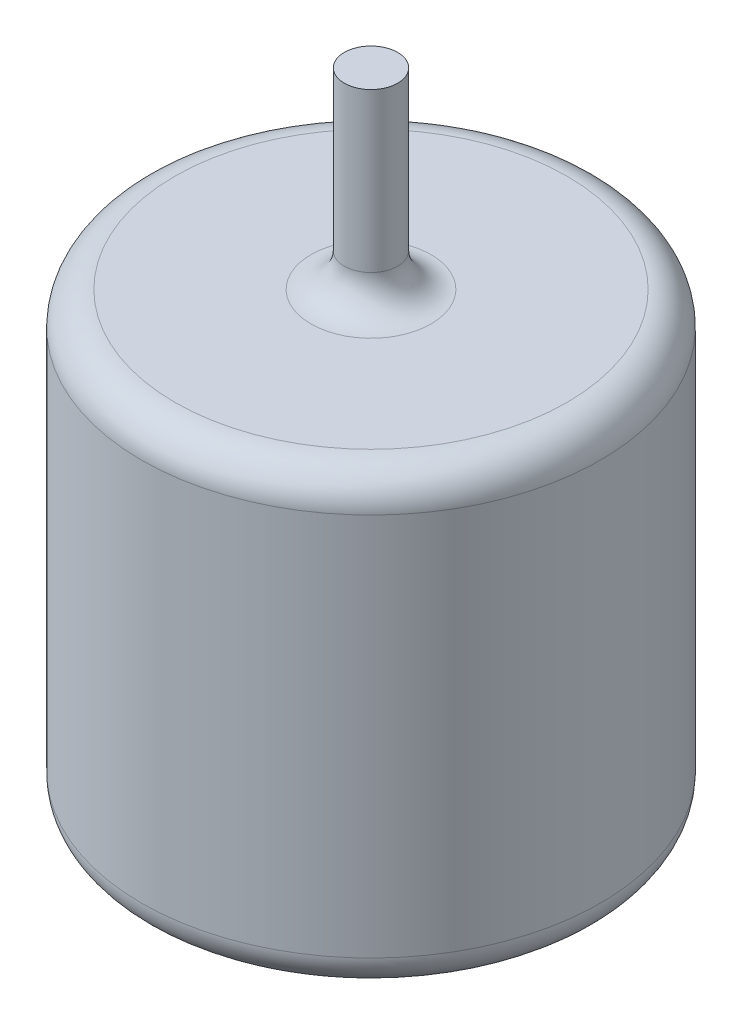
ISO-10303-21;
HEADER;
FILE_DESCRIPTION(('STEP AP214'),'2;1');
FILE_NAME('part.step','',(''),(''),'','','');
FILE_SCHEMA(('AUTOMOTIVE_DESIGN { 1 0 10303 214 1 1 1 1 }'));
ENDSEC;
DATA;
#1=APPLICATION_CONTEXT('core data for automotive mechanical design processes');
#2=APPLICATION_PROTOCOL_DEFINITION('international standard','automotive_design',2000,#1);
#3=PRODUCT_CONTEXT('',#1,'mechanical');
#4=PRODUCT('Part','Part','',(#3));
#5=PRODUCT_RELATED_PRODUCT_CATEGORY('part','',(#4));
#6=PRODUCT_DEFINITION_FORMATION('','',#4);
#7=PRODUCT_DEFINITION_CONTEXT('part definition',#1,'design');
#8=PRODUCT_DEFINITION('design','',#6,#7);
#9=PRODUCT_DEFINITION_SHAPE('','',#8);
#10=(LENGTH_UNIT() NAMED_UNIT(*) SI_UNIT(.MILLI.,.METRE.));
#11=(NAMED_UNIT(*) PLANE_ANGLE_UNIT() SI_UNIT($,.RADIAN.));
#12=(NAMED_UNIT(*) SI_UNIT($,.STERADIAN.) SOLID_ANGLE_UNIT());
#13=UNCERTAINTY_MEASURE_WITH_UNIT(LENGTH_MEASURE(1.E-05),#10,'distance_accuracy_value','');
#14=(GEOMETRIC_REPRESENTATION_CONTEXT(3) GLOBAL_UNCERTAINTY_ASSIGNED_CONTEXT((#13)) GLOBAL_UNIT_ASSIGNED_CONTEXT((#10,
#11,#12)) REPRESENTATION_CONTEXT('',''));
#15=CARTESIAN_POINT('',(0.,0.,0.));
#16=DIRECTION('',(0.,0.,1.));
#17=DIRECTION('',(1.,0.,0.));
#18=AXIS2_PLACEMENT_3D('',#15,#16,#17);
#19=CARTESIAN_POINT('',(0.,27.,0.));
#20=DIRECTION('',(0.,-1.,0.));
#21=DIRECTION('',(0.,0.,-1.));
#22=AXIS2_PLACEMENT_3D('',#19,#20,#21);
#23=CYLINDRICAL_SURFACE('',#22,13.75);
#24=CARTESIAN_POINT('',(0.,2.,0.));
#25=DIRECTION('',(0.,1.,0.));
#26=DIRECTION('',(0.,0.,1.));
#27=AXIS2_PLACEMENT_3D('',#24,#25,#26);
#28=CIRCLE('',#27,13.75);
#29=CARTESIAN_POINT('',(0.,2.,13.75));
#30=VERTEX_POINT('',#29);
#31=EDGE_CURVE('E53',#30,#30,#28,.T.);
#32=ORIENTED_EDGE('',*,*,#31,.T.);
#33=EDGE_LOOP('',(#32));
#34=FACE_BOUND('',#33,.T.);
#35=CARTESIAN_POINT('',(0.,25.,0.));
#36=DIRECTION('',(0.,1.,0.));
#37=DIRECTION('',(0.,0.,1.));
#38=AXIS2_PLACEMENT_3D('',#35,#36,#37);
#39=CIRCLE('',#38,13.75);
#40=CARTESIAN_POINT('',(0.,25.,13.75));
#41=VERTEX_POINT('',#40);
#42=EDGE_CURVE('E56',#41,#41,#39,.F.);
#43=ORIENTED_EDGE('',*,*,#42,.T.);
#44=EDGE_LOOP('',(#43));
#45=FACE_BOUND('',#44,.T.);
#46=ADVANCED_FACE('F33',(#34,#45),#23,.T.);
#47=CARTESIAN_POINT('',(0.,27.,0.));
#48=DIRECTION('',(0.,1.,0.));
#49=DIRECTION('',(0.,0.,1.));
#50=AXIS2_PLACEMENT_3D('',#47,#48,#49);
#51=PLANE('',#50);
#52=CARTESIAN_POINT('',(0.,27.,0.));
#53=DIRECTION('',(0.,1.,0.));
#54=DIRECTION('',(0.,0.,1.));
#55=AXIS2_PLACEMENT_3D('',#52,#53,#54);
#56=CIRCLE('',#55,11.75);
#57=CARTESIAN_POINT('',(0.,27.,11.75));
#58=VERTEX_POINT('',#57);
#59=EDGE_CURVE('E40',#58,#58,#56,.T.);
#60=ORIENTED_EDGE('',*,*,#59,.T.);
#61=EDGE_LOOP('',(#60));
#62=FACE_BOUND('',#61,.T.);
#63=CARTESIAN_POINT('',(0.,27.,0.));
#64=DIRECTION('',(0.,1.,0.));
#65=DIRECTION('',(0.,0.,1.));
#66=AXIS2_PLACEMENT_3D('',#63,#64,#65);
#67=CIRCLE('',#66,3.6);
#68=CARTESIAN_POINT('',(0.,27.,3.6));
#69=VERTEX_POINT('',#68);
#70=EDGE_CURVE('E44',#69,#69,#67,.F.);
#71=ORIENTED_EDGE('',*,*,#70,.T.);
#72=EDGE_LOOP('',(#71));
#73=FACE_BOUND('',#72,.T.);
#74=ADVANCED_FACE('F75',(#62,#73),#51,.T.);
#75=CARTESIAN_POINT('',(0.,0.,0.));
#76=DIRECTION('',(0.,1.,0.));
#77=DIRECTION('',(0.,0.,1.));
#78=AXIS2_PLACEMENT_3D('',#75,#76,#77);
#79=PLANE('',#78);
#80=CARTESIAN_POINT('',(0.,0.,0.));
#81=DIRECTION('',(0.,1.,0.));
#82=DIRECTION('',(0.,0.,1.));
#83=AXIS2_PLACEMENT_3D('',#80,#81,#82);
#84=CIRCLE('',#83,11.75);
#85=CARTESIAN_POINT('',(0.,0.,11.75));
#86=VERTEX_POINT('',#85);
#87=EDGE_CURVE('E48',#86,#86,#84,.F.);
#88=ORIENTED_EDGE('',*,*,#87,.T.);
#89=EDGE_LOOP('',(#88));
#90=FACE_BOUND('',#89,.T.);
#91=ADVANCED_FACE('F67',(#90),#79,.F.);
#92=CARTESIAN_POINT('',(0.,38.5,0.));
#93=DIRECTION('',(0.,-1.,0.));
#94=DIRECTION('',(0.,0.,-1.));
#95=AXIS2_PLACEMENT_3D('',#92,#93,#94);
#96=CYLINDRICAL_SURFACE('',#95,1.6);
#97=CARTESIAN_POINT('',(0.,29.,0.));
#98=DIRECTION('',(0.,1.,0.));
#99=DIRECTION('',(0.,0.,1.));
#100=AXIS2_PLACEMENT_3D('',#97,#98,#99);
#101=CIRCLE('',#100,1.6);
#102=CARTESIAN_POINT('',(0.,29.,1.6));
#103=VERTEX_POINT('',#102);
#104=EDGE_CURVE('E10',#103,#103,#101,.T.);
#105=ORIENTED_EDGE('',*,*,#104,.T.);
#106=EDGE_LOOP('',(#105));
#107=FACE_BOUND('',#106,.T.);
#108=CARTESIAN_POINT('',(0.,38.5,0.));
#109=DIRECTION('',(0.,1.,0.));
#110=DIRECTION('',(0.,0.,1.));
#111=AXIS2_PLACEMENT_3D('',#108,#109,#110);
#112=CIRCLE('',#111,1.6);
#113=CARTESIAN_POINT('',(0.,38.5,1.6));
#114=VERTEX_POINT('',#113);
#115=EDGE_CURVE('E59',#114,#114,#112,.T.);
#116=ORIENTED_EDGE('',*,*,#115,.F.);
#117=EDGE_LOOP('',(#116));
#118=FACE_BOUND('',#117,.T.);
#119=ADVANCED_FACE('F65',(#107,#118),#96,.T.);
#120=CARTESIAN_POINT('',(0.,38.5,0.));
#121=DIRECTION('',(0.,1.,0.));
#122=DIRECTION('',(0.,0.,1.));
#123=AXIS2_PLACEMENT_3D('',#120,#121,#122);
#124=PLANE('',#123);
#125=ORIENTED_EDGE('',*,*,#115,.T.);
#126=EDGE_LOOP('',(#125));
#127=FACE_BOUND('',#126,.T.);
#128=ADVANCED_FACE('F63',(#127),#124,.T.);
#129=CARTESIAN_POINT('',(0.,2.,0.));
#130=DIRECTION('',(0.,1.,0.));
#131=DIRECTION('',(0.,0.,1.));
#132=AXIS2_PLACEMENT_3D('',#129,#130,#131);
#133=TOROIDAL_SURFACE('',#132,11.75,2.);
#134=ORIENTED_EDGE('',*,*,#87,.F.);
#135=EDGE_LOOP('',(#134));
#136=FACE_BOUND('',#135,.T.);
#137=ORIENTED_EDGE('',*,*,#31,.F.);
#138=EDGE_LOOP('',(#137));
#139=FACE_BOUND('',#138,.T.);
#140=ADVANCED_FACE('F73',(#136,#139),#133,.T.);
#141=CARTESIAN_POINT('',(0.,25.,0.));
#142=DIRECTION('',(0.,1.,0.));
#143=DIRECTION('',(0.,0.,1.));
#144=AXIS2_PLACEMENT_3D('',#141,#142,#143);
#145=TOROIDAL_SURFACE('',#144,11.75,2.);
#146=ORIENTED_EDGE('',*,*,#42,.F.);
#147=EDGE_LOOP('',(#146));
#148=FACE_BOUND('',#147,.T.);
#149=ORIENTED_EDGE('',*,*,#59,.F.);
#150=EDGE_LOOP('',(#149));
#151=FACE_BOUND('',#150,.T.);
#152=ADVANCED_FACE('F88',(#148,#151),#145,.T.);
#153=CARTESIAN_POINT('',(0.,29.,0.));
#154=DIRECTION('',(0.,1.,0.));
#155=DIRECTION('',(0.,0.,1.));
#156=AXIS2_PLACEMENT_3D('',#153,#154,#155);
#157=TOROIDAL_SURFACE('',#156,3.6,2.);
#158=ORIENTED_EDGE('',*,*,#70,.F.);
#159=EDGE_LOOP('',(#158));
#160=FACE_BOUND('',#159,.T.);
#161=ORIENTED_EDGE('',*,*,#104,.F.);
#162=EDGE_LOOP('',(#161));
#163=FACE_BOUND('',#162,.T.);
#164=ADVANCED_FACE('F35',(#160,#163),#157,.F.);
#165=CLOSED_SHELL('',(#46,#74,#91,#119,#128,#140,#152,#164));
#166=MANIFOLD_SOLID_BREP('B2',#165);
#167=ADVANCED_BREP_SHAPE_REPRESENTATION('',(#18,#166),#14);
#168=SHAPE_DEFINITION_REPRESENTATION(#9,#167);
ENDSEC;
END-ISO-10303-21;
